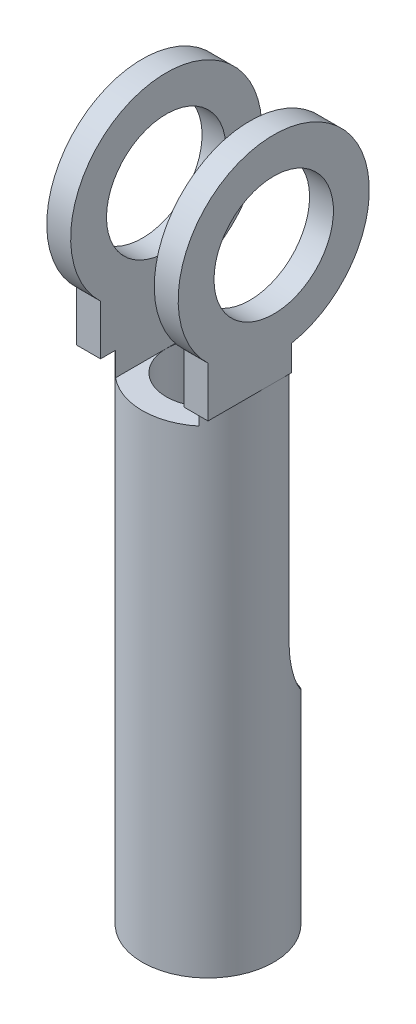
ISO-10303-21;
HEADER;
FILE_DESCRIPTION(('STEP AP214'),'2;1');
FILE_NAME('part.step','',(''),(''),'','','');
FILE_SCHEMA(('AUTOMOTIVE_DESIGN { 1 0 10303 214 1 1 1 1 }'));
ENDSEC;
DATA;
#1=APPLICATION_CONTEXT('core data for automotive mechanical design processes');
#2=APPLICATION_PROTOCOL_DEFINITION('international standard','automotive_design',2000,#1);
#3=PRODUCT_CONTEXT('',#1,'mechanical');
#4=PRODUCT('Part','Part','',(#3));
#5=PRODUCT_RELATED_PRODUCT_CATEGORY('part','',(#4));
#6=PRODUCT_DEFINITION_FORMATION('','',#4);
#7=PRODUCT_DEFINITION_CONTEXT('part definition',#1,'design');
#8=PRODUCT_DEFINITION('design','',#6,#7);
#9=PRODUCT_DEFINITION_SHAPE('','',#8);
#10=(LENGTH_UNIT() NAMED_UNIT(*) SI_UNIT(.MILLI.,.METRE.));
#11=(NAMED_UNIT(*) PLANE_ANGLE_UNIT() SI_UNIT($,.RADIAN.));
#12=(NAMED_UNIT(*) SI_UNIT($,.STERADIAN.) SOLID_ANGLE_UNIT());
#13=UNCERTAINTY_MEASURE_WITH_UNIT(LENGTH_MEASURE(1.E-05),#10,'distance_accuracy_value','');
#14=(GEOMETRIC_REPRESENTATION_CONTEXT(3) GLOBAL_UNCERTAINTY_ASSIGNED_CONTEXT((#13)) GLOBAL_UNIT_ASSIGNED_CONTEXT((#10,
#11,#12)) REPRESENTATION_CONTEXT('',''));
#15=CARTESIAN_POINT('',(0.,0.,0.));
#16=DIRECTION('',(0.,0.,1.));
#17=DIRECTION('',(1.,0.,0.));
#18=AXIS2_PLACEMENT_3D('',#15,#16,#17);
#19=CARTESIAN_POINT('',(2.75,30.,-4.));
#20=DIRECTION('',(-1.,0.,0.));
#21=DIRECTION('',(0.,0.,1.));
#22=AXIS2_PLACEMENT_3D('',#19,#20,#21);
#23=PLANE('',#22);
#24=CARTESIAN_POINT('',(2.75,26.,0.));
#25=DIRECTION('',(-1.,0.,0.));
#26=DIRECTION('',(0.,0.,1.));
#27=AXIS2_PLACEMENT_3D('',#24,#25,#26);
#28=CIRCLE('',#27,2.5);
#29=CARTESIAN_POINT('',(2.75,26.,2.5));
#30=VERTEX_POINT('',#29);
#31=EDGE_CURVE('E273',#30,#30,#28,.T.);
#32=ORIENTED_EDGE('',*,*,#31,.T.);
#33=EDGE_LOOP('',(#32));
#34=FACE_BOUND('',#33,.T.);
#35=DIRECTION('',(0.,0.,-1.));
#36=VECTOR('',#35,1.);
#37=CARTESIAN_POINT('',(2.75,21.,-4.2121708077484));
#38=LINE('',#37,#36);
#39=CARTESIAN_POINT('',(2.75,21.,0.));
#40=VERTEX_POINT('',#39);
#41=CARTESIAN_POINT('',(2.75,21.,-0.749999999999998));
#42=VERTEX_POINT('',#41);
#43=EDGE_CURVE('E229',#40,#42,#38,.T.);
#44=ORIENTED_EDGE('',*,*,#43,.T.);
#45=DIRECTION('',(0.,1.,0.));
#46=VECTOR('',#45,1.);
#47=CARTESIAN_POINT('',(2.75,14.8976549918115,-0.749999999999998));
#48=LINE('',#47,#46);
#49=CARTESIAN_POINT('',(2.75,22.0709415886246,-0.749999999999999));
#50=VERTEX_POINT('',#49);
#51=EDGE_CURVE('E298',#42,#50,#48,.T.);
#52=ORIENTED_EDGE('',*,*,#51,.T.);
#53=CARTESIAN_POINT('',(2.75,26.,0.));
#54=DIRECTION('',(-1.,0.,0.));
#55=DIRECTION('',(0.,0.,1.));
#56=AXIS2_PLACEMENT_3D('',#53,#54,#55);
#57=CIRCLE('',#56,4.);
#58=CARTESIAN_POINT('',(2.75,23.0952624903444,2.75));
#59=VERTEX_POINT('',#58);
#60=EDGE_CURVE('E295',#59,#50,#57,.T.);
#61=ORIENTED_EDGE('',*,*,#60,.F.);
#62=DIRECTION('',(0.,1.,0.));
#63=VECTOR('',#62,1.);
#64=CARTESIAN_POINT('',(2.75,14.8976549918115,2.75));
#65=LINE('',#64,#63);
#66=CARTESIAN_POINT('',(2.75,21.,2.75));
#67=VERTEX_POINT('',#66);
#68=EDGE_CURVE('E256',#67,#59,#65,.T.);
#69=ORIENTED_EDGE('',*,*,#68,.F.);
#70=DIRECTION('',(0.,0.,-1.));
#71=VECTOR('',#70,1.);
#72=CARTESIAN_POINT('',(2.75,21.,-4.2121708077484));
#73=LINE('',#72,#71);
#74=EDGE_CURVE('E130',#67,#40,#73,.T.);
#75=ORIENTED_EDGE('',*,*,#74,.T.);
#76=EDGE_LOOP('',(#44,#52,#61,#69,#75));
#77=FACE_BOUND('',#76,.T.);
#78=ADVANCED_FACE('F113',(#34,#77),#23,.F.);
#79=CARTESIAN_POINT('',(-2.75,20.,-0.749999999999999));
#80=DIRECTION('',(0.,0.,1.));
#81=DIRECTION('',(0.,-1.,0.));
#82=AXIS2_PLACEMENT_3D('',#79,#80,#81);
#83=PLANE('',#82);
#84=DIRECTION('',(-1.,0.,0.));
#85=VECTOR('',#84,1.);
#86=CARTESIAN_POINT('',(0.,21.,-0.750000000000002));
#87=LINE('',#86,#85);
#88=CARTESIAN_POINT('',(2.64575131106459,21.,-0.749999999999999));
#89=VERTEX_POINT('',#88);
#90=EDGE_CURVE('E234',#42,#89,#87,.T.);
#91=ORIENTED_EDGE('',*,*,#90,.T.);
#92=DIRECTION('',(0.,-1.,0.));
#93=VECTOR('',#92,1.);
#94=CARTESIAN_POINT('',(2.64575131106459,20.,-0.749999999999999));
#95=LINE('',#94,#93);
#96=CARTESIAN_POINT('',(2.64575131106459,11.1622776601684,-0.75));
#97=VERTEX_POINT('',#96);
#98=EDGE_CURVE('E246',#97,#89,#95,.F.);
#99=ORIENTED_EDGE('',*,*,#98,.F.);
#100=DIRECTION('',(1.,0.,0.));
#101=VECTOR('',#100,1.);
#102=CARTESIAN_POINT('',(-2.75,11.1622776601684,-0.75));
#103=LINE('',#102,#101);
#104=CARTESIAN_POINT('',(1.58113883008419,11.1622776601684,-0.749999999999999));
#105=VERTEX_POINT('',#104);
#106=EDGE_CURVE('E321',#105,#97,#103,.T.);
#107=ORIENTED_EDGE('',*,*,#106,.F.);
#108=DIRECTION('',(0.,-1.,0.));
#109=VECTOR('',#108,1.);
#110=CARTESIAN_POINT('',(1.58113883008419,20.,-0.749999999999999));
#111=LINE('',#110,#109);
#112=CARTESIAN_POINT('',(1.58113883008419,20.,-0.749999999999999));
#113=VERTEX_POINT('',#112);
#114=EDGE_CURVE('E364',#105,#113,#111,.F.);
#115=ORIENTED_EDGE('',*,*,#114,.T.);
#116=DIRECTION('',(1.,0.,0.));
#117=VECTOR('',#116,1.);
#118=CARTESIAN_POINT('',(-2.75,20.,-0.749999999999999));
#119=LINE('',#118,#117);
#120=CARTESIAN_POINT('',(1.75,20.,-0.749999999999999));
#121=VERTEX_POINT('',#120);
#122=EDGE_CURVE('E326',#113,#121,#119,.T.);
#123=ORIENTED_EDGE('',*,*,#122,.T.);
#124=DIRECTION('',(0.,-1.,0.));
#125=VECTOR('',#124,1.);
#126=CARTESIAN_POINT('',(1.75,30.,-0.749999999999999));
#127=LINE('',#126,#125);
#128=CARTESIAN_POINT('',(1.75,22.0709415886246,-0.749999999999999));
#129=VERTEX_POINT('',#128);
#130=EDGE_CURVE('E123',#129,#121,#127,.T.);
#131=ORIENTED_EDGE('',*,*,#130,.F.);
#132=DIRECTION('',(-1.,0.,0.));
#133=VECTOR('',#132,1.);
#134=CARTESIAN_POINT('',(2.75,22.0709415886246,-0.749999999999999));
#135=LINE('',#134,#133);
#136=EDGE_CURVE('E305',#50,#129,#135,.T.);
#137=ORIENTED_EDGE('',*,*,#136,.F.);
#138=ORIENTED_EDGE('',*,*,#51,.F.);
#139=EDGE_LOOP('',(#91,#99,#107,#115,#123,#131,#137,#138));
#140=FACE_BOUND('',#139,.T.);
#141=ADVANCED_FACE('F385',(#140),#83,.F.);
#142=CARTESIAN_POINT('',(-2.75,30.,-4.));
#143=DIRECTION('',(1.,0.,0.));
#144=DIRECTION('',(0.,0.,-1.));
#145=AXIS2_PLACEMENT_3D('',#142,#143,#144);
#146=PLANE('',#145);
#147=CARTESIAN_POINT('',(-2.75,26.,0.));
#148=DIRECTION('',(-1.,0.,0.));
#149=DIRECTION('',(0.,0.,1.));
#150=AXIS2_PLACEMENT_3D('',#147,#148,#149);
#151=CIRCLE('',#150,2.5);
#152=CARTESIAN_POINT('',(-2.75,26.,2.5));
#153=VERTEX_POINT('',#152);
#154=EDGE_CURVE('E274',#153,#153,#151,.T.);
#155=ORIENTED_EDGE('',*,*,#154,.F.);
#156=EDGE_LOOP('',(#155));
#157=FACE_BOUND('',#156,.T.);
#158=DIRECTION('',(0.,0.,-1.));
#159=VECTOR('',#158,1.);
#160=CARTESIAN_POINT('',(-2.75,21.,-4.2121708077484));
#161=LINE('',#160,#159);
#162=CARTESIAN_POINT('',(-2.75,21.,0.));
#163=VERTEX_POINT('',#162);
#164=CARTESIAN_POINT('',(-2.75,21.,-0.749999999999999));
#165=VERTEX_POINT('',#164);
#166=EDGE_CURVE('E408',#163,#165,#161,.T.);
#167=ORIENTED_EDGE('',*,*,#166,.F.);
#168=DIRECTION('',(0.,0.,-1.));
#169=VECTOR('',#168,1.);
#170=CARTESIAN_POINT('',(-2.75,21.,-4.2121708077484));
#171=LINE('',#170,#169);
#172=CARTESIAN_POINT('',(-2.75,21.,2.75));
#173=VERTEX_POINT('',#172);
#174=EDGE_CURVE('E267',#173,#163,#171,.T.);
#175=ORIENTED_EDGE('',*,*,#174,.F.);
#176=DIRECTION('',(0.,1.,0.));
#177=VECTOR('',#176,1.);
#178=CARTESIAN_POINT('',(-2.75,14.8976549918115,2.75));
#179=LINE('',#178,#177);
#180=CARTESIAN_POINT('',(-2.75,23.0952624903444,2.75));
#181=VERTEX_POINT('',#180);
#182=EDGE_CURVE('E285',#173,#181,#179,.T.);
#183=ORIENTED_EDGE('',*,*,#182,.T.);
#184=CARTESIAN_POINT('',(-2.75,26.,0.));
#185=DIRECTION('',(-1.,0.,0.));
#186=DIRECTION('',(0.,0.,1.));
#187=AXIS2_PLACEMENT_3D('',#184,#185,#186);
#188=CIRCLE('',#187,4.);
#189=CARTESIAN_POINT('',(-2.75,22.0709415886246,-0.749999999999999));
#190=VERTEX_POINT('',#189);
#191=EDGE_CURVE('E294',#181,#190,#188,.T.);
#192=ORIENTED_EDGE('',*,*,#191,.T.);
#193=DIRECTION('',(0.,1.,0.));
#194=VECTOR('',#193,1.);
#195=CARTESIAN_POINT('',(-2.75,14.8976549918115,-0.749999999999999));
#196=LINE('',#195,#194);
#197=EDGE_CURVE('E299',#165,#190,#196,.T.);
#198=ORIENTED_EDGE('',*,*,#197,.F.);
#199=EDGE_LOOP('',(#167,#175,#183,#192,#198));
#200=FACE_BOUND('',#199,.T.);
#201=ADVANCED_FACE('F391',(#157,#200),#146,.F.);
#202=DIRECTION('',(0.,-1.,0.));
#203=VECTOR('',#202,1.);
#204=CARTESIAN_POINT('',(-2.64575131106459,20.,-0.749999999999999));
#205=LINE('',#204,#203);
#206=CARTESIAN_POINT('',(-2.64575131106459,21.,-0.749999999999999));
#207=VERTEX_POINT('',#206);
#208=CARTESIAN_POINT('',(-2.64575131106459,11.1622776601684,-0.75));
#209=VERTEX_POINT('',#208);
#210=EDGE_CURVE('E330',#207,#209,#205,.T.);
#211=ORIENTED_EDGE('',*,*,#210,.F.);
#212=DIRECTION('',(1.,0.,0.));
#213=VECTOR('',#212,1.);
#214=CARTESIAN_POINT('',(0.,21.,-0.749999999999999));
#215=LINE('',#214,#213);
#216=EDGE_CURVE('E413',#165,#207,#215,.T.);
#217=ORIENTED_EDGE('',*,*,#216,.F.);
#218=ORIENTED_EDGE('',*,*,#197,.T.);
#219=CARTESIAN_POINT('',(-1.75,22.0709415886246,-0.749999999999999));
#220=VERTEX_POINT('',#219);
#221=EDGE_CURVE('E301',#220,#190,#135,.T.);
#222=ORIENTED_EDGE('',*,*,#221,.F.);
#223=DIRECTION('',(0.,1.,0.));
#224=VECTOR('',#223,1.);
#225=CARTESIAN_POINT('',(-1.75,30.,-0.75));
#226=LINE('',#225,#224);
#227=CARTESIAN_POINT('',(-1.75,20.,-0.749999999999999));
#228=VERTEX_POINT('',#227);
#229=EDGE_CURVE('E308',#228,#220,#226,.T.);
#230=ORIENTED_EDGE('',*,*,#229,.F.);
#231=CARTESIAN_POINT('',(-1.58113883008419,20.,-0.749999999999999));
#232=VERTEX_POINT('',#231);
#233=EDGE_CURVE('E325',#228,#232,#119,.T.);
#234=ORIENTED_EDGE('',*,*,#233,.T.);
#235=DIRECTION('',(0.,-1.,0.));
#236=VECTOR('',#235,1.);
#237=CARTESIAN_POINT('',(-1.58113883008419,20.,-0.749999999999999));
#238=LINE('',#237,#236);
#239=CARTESIAN_POINT('',(-1.58113883008419,11.1622776601684,-0.75));
#240=VERTEX_POINT('',#239);
#241=EDGE_CURVE('E363',#232,#240,#238,.T.);
#242=ORIENTED_EDGE('',*,*,#241,.T.);
#243=EDGE_CURVE('E324',#209,#240,#103,.T.);
#244=ORIENTED_EDGE('',*,*,#243,.F.);
#245=EDGE_LOOP('',(#211,#217,#218,#222,#230,#234,#242,#244));
#246=FACE_BOUND('',#245,.T.);
#247=ADVANCED_FACE('F352',(#246),#83,.F.);
#248=CARTESIAN_POINT('',(2.75,14.8976549918115,2.75));
#249=DIRECTION('',(0.,0.,1.));
#250=DIRECTION('',(1.,0.,0.));
#251=AXIS2_PLACEMENT_3D('',#248,#249,#250);
#252=PLANE('',#251);
#253=DIRECTION('',(0.,-1.,0.));
#254=VECTOR('',#253,1.);
#255=CARTESIAN_POINT('',(1.75,30.,2.75));
#256=LINE('',#255,#254);
#257=CARTESIAN_POINT('',(1.75,23.0952624903444,2.75));
#258=VERTEX_POINT('',#257);
#259=CARTESIAN_POINT('',(1.75,21.,2.75));
#260=VERTEX_POINT('',#259);
#261=EDGE_CURVE('E284',#258,#260,#256,.T.);
#262=ORIENTED_EDGE('',*,*,#261,.T.);
#263=DIRECTION('',(-1.,0.,0.));
#264=VECTOR('',#263,1.);
#265=CARTESIAN_POINT('',(0.,21.,2.75));
#266=LINE('',#265,#264);
#267=EDGE_CURVE('E251',#67,#260,#266,.T.);
#268=ORIENTED_EDGE('',*,*,#267,.F.);
#269=ORIENTED_EDGE('',*,*,#68,.T.);
#270=DIRECTION('',(-1.,0.,0.));
#271=VECTOR('',#270,1.);
#272=CARTESIAN_POINT('',(2.75,23.0952624903444,2.75));
#273=LINE('',#272,#271);
#274=EDGE_CURVE('E287',#59,#258,#273,.T.);
#275=ORIENTED_EDGE('',*,*,#274,.T.);
#276=EDGE_LOOP('',(#262,#268,#269,#275));
#277=FACE_BOUND('',#276,.T.);
#278=ADVANCED_FACE('F401',(#277),#252,.T.);
#279=CARTESIAN_POINT('',(-1.75,30.,-4.));
#280=DIRECTION('',(-1.,0.,0.));
#281=DIRECTION('',(0.,0.,1.));
#282=AXIS2_PLACEMENT_3D('',#279,#280,#281);
#283=PLANE('',#282);
#284=CARTESIAN_POINT('',(-1.75,26.,0.));
#285=DIRECTION('',(-1.,0.,0.));
#286=DIRECTION('',(0.,0.,1.));
#287=AXIS2_PLACEMENT_3D('',#284,#285,#286);
#288=CIRCLE('',#287,2.5);
#289=CARTESIAN_POINT('',(-1.75,26.,2.5));
#290=VERTEX_POINT('',#289);
#291=EDGE_CURVE('E279',#290,#290,#288,.T.);
#292=ORIENTED_EDGE('',*,*,#291,.T.);
#293=EDGE_LOOP('',(#292));
#294=FACE_BOUND('',#293,.T.);
#295=DIRECTION('',(0.,-1.,0.));
#296=VECTOR('',#295,1.);
#297=CARTESIAN_POINT('',(-1.75,21.,2.12132034355964));
#298=LINE('',#297,#296);
#299=CARTESIAN_POINT('',(-1.75,20.,2.12132034355964));
#300=VERTEX_POINT('',#299);
#301=CARTESIAN_POINT('',(-1.75,21.,2.12132034355964));
#302=VERTEX_POINT('',#301);
#303=EDGE_CURVE('E271',#300,#302,#298,.F.);
#304=ORIENTED_EDGE('',*,*,#303,.F.);
#305=DIRECTION('',(0.,0.,-1.));
#306=VECTOR('',#305,1.);
#307=CARTESIAN_POINT('',(-1.75,20.,-4.));
#308=LINE('',#307,#306);
#309=CARTESIAN_POINT('',(-1.75,20.,0.));
#310=VERTEX_POINT('',#309);
#311=EDGE_CURVE('E317',#300,#310,#308,.T.);
#312=ORIENTED_EDGE('',*,*,#311,.T.);
#313=EDGE_CURVE('E320',#310,#228,#308,.T.);
#314=ORIENTED_EDGE('',*,*,#313,.T.);
#315=ORIENTED_EDGE('',*,*,#229,.T.);
#316=CARTESIAN_POINT('',(-1.75,26.,0.));
#317=DIRECTION('',(-1.,0.,0.));
#318=DIRECTION('',(0.,0.,1.));
#319=AXIS2_PLACEMENT_3D('',#316,#317,#318);
#320=CIRCLE('',#319,4.);
#321=CARTESIAN_POINT('',(-1.75,23.0952624903444,2.75));
#322=VERTEX_POINT('',#321);
#323=EDGE_CURVE('E311',#322,#220,#320,.T.);
#324=ORIENTED_EDGE('',*,*,#323,.F.);
#325=DIRECTION('',(0.,1.,0.));
#326=VECTOR('',#325,1.);
#327=CARTESIAN_POINT('',(-1.75,30.,2.75));
#328=LINE('',#327,#326);
#329=CARTESIAN_POINT('',(-1.75,21.,2.75));
#330=VERTEX_POINT('',#329);
#331=EDGE_CURVE('E292',#330,#322,#328,.T.);
#332=ORIENTED_EDGE('',*,*,#331,.F.);
#333=DIRECTION('',(0.,0.,1.));
#334=VECTOR('',#333,1.);
#335=CARTESIAN_POINT('',(-1.75,21.,-4.));
#336=LINE('',#335,#334);
#337=EDGE_CURVE('E138',#302,#330,#336,.T.);
#338=ORIENTED_EDGE('',*,*,#337,.F.);
#339=EDGE_LOOP('',(#304,#312,#314,#315,#324,#332,#338));
#340=FACE_BOUND('',#339,.T.);
#341=ADVANCED_FACE('F350',(#294,#340),#283,.F.);
#342=ORIENTED_EDGE('',*,*,#182,.F.);
#343=DIRECTION('',(1.,0.,0.));
#344=VECTOR('',#343,1.);
#345=CARTESIAN_POINT('',(0.,21.,2.75));
#346=LINE('',#345,#344);
#347=EDGE_CURVE('E265',#173,#330,#346,.T.);
#348=ORIENTED_EDGE('',*,*,#347,.T.);
#349=ORIENTED_EDGE('',*,*,#331,.T.);
#350=EDGE_CURVE('E282',#322,#181,#273,.T.);
#351=ORIENTED_EDGE('',*,*,#350,.T.);
#352=EDGE_LOOP('',(#342,#348,#349,#351));
#353=FACE_BOUND('',#352,.T.);
#354=ADVANCED_FACE('F420',(#353),#252,.T.);
#355=CARTESIAN_POINT('',(1.75,30.,-4.));
#356=DIRECTION('',(1.,0.,0.));
#357=DIRECTION('',(0.,0.,-1.));
#358=AXIS2_PLACEMENT_3D('',#355,#356,#357);
#359=PLANE('',#358);
#360=CARTESIAN_POINT('',(1.75,26.,0.));
#361=DIRECTION('',(1.,0.,0.));
#362=DIRECTION('',(0.,0.,-1.));
#363=AXIS2_PLACEMENT_3D('',#360,#361,#362);
#364=CIRCLE('',#363,2.5);
#365=CARTESIAN_POINT('',(1.75,26.,-2.5));
#366=VERTEX_POINT('',#365);
#367=EDGE_CURVE('E118',#366,#366,#364,.T.);
#368=ORIENTED_EDGE('',*,*,#367,.T.);
#369=EDGE_LOOP('',(#368));
#370=FACE_BOUND('',#369,.T.);
#371=DIRECTION('',(0.,0.,1.));
#372=VECTOR('',#371,1.);
#373=CARTESIAN_POINT('',(1.75,20.,-4.));
#374=LINE('',#373,#372);
#375=CARTESIAN_POINT('',(1.75,20.,0.));
#376=VERTEX_POINT('',#375);
#377=CARTESIAN_POINT('',(1.75,20.,2.12132034355964));
#378=VERTEX_POINT('',#377);
#379=EDGE_CURVE('E313',#376,#378,#374,.T.);
#380=ORIENTED_EDGE('',*,*,#379,.T.);
#381=DIRECTION('',(0.,-1.,0.));
#382=VECTOR('',#381,1.);
#383=CARTESIAN_POINT('',(1.75,21.,2.12132034355964));
#384=LINE('',#383,#382);
#385=CARTESIAN_POINT('',(1.75,21.,2.12132034355964));
#386=VERTEX_POINT('',#385);
#387=EDGE_CURVE('E258',#378,#386,#384,.F.);
#388=ORIENTED_EDGE('',*,*,#387,.T.);
#389=DIRECTION('',(0.,0.,-1.));
#390=VECTOR('',#389,1.);
#391=CARTESIAN_POINT('',(1.75,21.,-4.));
#392=LINE('',#391,#390);
#393=EDGE_CURVE('E250',#260,#386,#392,.T.);
#394=ORIENTED_EDGE('',*,*,#393,.F.);
#395=ORIENTED_EDGE('',*,*,#261,.F.);
#396=CARTESIAN_POINT('',(1.75,26.,0.));
#397=DIRECTION('',(1.,0.,0.));
#398=DIRECTION('',(0.,0.,-1.));
#399=AXIS2_PLACEMENT_3D('',#396,#397,#398);
#400=CIRCLE('',#399,4.);
#401=EDGE_CURVE('E12',#129,#258,#400,.T.);
#402=ORIENTED_EDGE('',*,*,#401,.F.);
#403=ORIENTED_EDGE('',*,*,#130,.T.);
#404=EDGE_CURVE('E316',#121,#376,#374,.T.);
#405=ORIENTED_EDGE('',*,*,#404,.T.);
#406=EDGE_LOOP('',(#380,#388,#394,#395,#402,#403,#405));
#407=FACE_BOUND('',#406,.T.);
#408=ADVANCED_FACE('F394',(#370,#407),#359,.F.);
#409=CARTESIAN_POINT('',(0.,20.,0.));
#410=DIRECTION('',(0.,1.,0.));
#411=DIRECTION('',(0.,0.,1.));
#412=AXIS2_PLACEMENT_3D('',#409,#410,#411);
#413=PLANE('',#412);
#414=CARTESIAN_POINT('',(0.,20.,0.));
#415=DIRECTION('',(0.,1.,0.));
#416=DIRECTION('',(0.,0.,1.));
#417=AXIS2_PLACEMENT_3D('',#414,#415,#416);
#418=CIRCLE('',#417,2.75);
#419=EDGE_CURVE('E444',#300,#378,#418,.T.);
#420=ORIENTED_EDGE('',*,*,#419,.T.);
#421=ORIENTED_EDGE('',*,*,#379,.F.);
#422=CARTESIAN_POINT('',(0.,20.,0.));
#423=DIRECTION('',(0.,1.,0.));
#424=DIRECTION('',(0.,0.,1.));
#425=AXIS2_PLACEMENT_3D('',#422,#423,#424);
#426=CIRCLE('',#425,1.75);
#427=EDGE_CURVE('E454',#310,#376,#426,.T.);
#428=ORIENTED_EDGE('',*,*,#427,.F.);
#429=ORIENTED_EDGE('',*,*,#311,.F.);
#430=EDGE_LOOP('',(#420,#421,#428,#429));
#431=FACE_BOUND('',#430,.T.);
#432=ADVANCED_FACE('F376',(#431),#413,.T.);
#433=EDGE_CURVE('E452',#376,#113,#426,.T.);
#434=ORIENTED_EDGE('',*,*,#433,.F.);
#435=ORIENTED_EDGE('',*,*,#404,.F.);
#436=ORIENTED_EDGE('',*,*,#122,.F.);
#437=EDGE_LOOP('',(#434,#435,#436));
#438=FACE_BOUND('',#437,.T.);
#439=ADVANCED_FACE('F374',(#438),#413,.T.);
#440=ORIENTED_EDGE('',*,*,#313,.F.);
#441=EDGE_CURVE('E340',#232,#310,#426,.T.);
#442=ORIENTED_EDGE('',*,*,#441,.F.);
#443=ORIENTED_EDGE('',*,*,#233,.F.);
#444=EDGE_LOOP('',(#440,#442,#443));
#445=FACE_BOUND('',#444,.T.);
#446=ADVANCED_FACE('F371',(#445),#413,.T.);
#447=CARTESIAN_POINT('',(0.,0.,0.));
#448=DIRECTION('',(0.,1.,0.));
#449=DIRECTION('',(0.,0.,1.));
#450=AXIS2_PLACEMENT_3D('',#447,#448,#449);
#451=PLANE('',#450);
#452=CARTESIAN_POINT('',(0.,0.,0.));
#453=DIRECTION('',(0.,1.,0.));
#454=DIRECTION('',(0.,0.,1.));
#455=AXIS2_PLACEMENT_3D('',#452,#453,#454);
#456=CIRCLE('',#455,2.75);
#457=CARTESIAN_POINT('',(0.,0.,2.75));
#458=VERTEX_POINT('',#457);
#459=EDGE_CURVE('E447',#458,#458,#456,.T.);
#460=ORIENTED_EDGE('',*,*,#459,.F.);
#461=EDGE_LOOP('',(#460));
#462=FACE_BOUND('',#461,.T.);
#463=CARTESIAN_POINT('',(0.,0.,0.));
#464=DIRECTION('',(0.,1.,0.));
#465=DIRECTION('',(0.,0.,1.));
#466=AXIS2_PLACEMENT_3D('',#463,#464,#465);
#467=CIRCLE('',#466,1.75);
#468=CARTESIAN_POINT('',(0.,0.,1.75));
#469=VERTEX_POINT('',#468);
#470=EDGE_CURVE('E339',#469,#469,#467,.T.);
#471=ORIENTED_EDGE('',*,*,#470,.T.);
#472=EDGE_LOOP('',(#471));
#473=FACE_BOUND('',#472,.T.);
#474=ADVANCED_FACE('F373',(#462,#473),#451,.F.);
#475=CARTESIAN_POINT('',(0.,20.,0.));
#476=DIRECTION('',(0.,-1.,0.));
#477=DIRECTION('',(0.,0.,-1.));
#478=AXIS2_PLACEMENT_3D('',#475,#476,#477);
#479=CYLINDRICAL_SURFACE('',#478,2.75);
#480=CARTESIAN_POINT('',(0.,21.,0.));
#481=DIRECTION('',(0.,-1.,0.));
#482=DIRECTION('',(0.,0.,-1.));
#483=AXIS2_PLACEMENT_3D('',#480,#481,#482);
#484=CIRCLE('',#483,2.75);
#485=EDGE_CURVE('E263',#302,#163,#484,.T.);
#486=ORIENTED_EDGE('',*,*,#485,.T.);
#487=CARTESIAN_POINT('',(0.,21.,0.));
#488=DIRECTION('',(0.,-1.,0.));
#489=DIRECTION('',(0.,0.,-1.));
#490=AXIS2_PLACEMENT_3D('',#487,#488,#489);
#491=CIRCLE('',#490,2.75);
#492=EDGE_CURVE('E252',#163,#207,#491,.T.);
#493=ORIENTED_EDGE('',*,*,#492,.T.);
#494=ORIENTED_EDGE('',*,*,#210,.T.);
#495=CARTESIAN_POINT('',(-2.64575131106459,11.1622776601684,-0.75));
#496=CARTESIAN_POINT('',(-2.6457200406596,11.0703917954332,-0.749988804882271));
#497=CARTESIAN_POINT('',(-2.64472449352821,10.978503232409,-0.753618021003756));
#498=CARTESIAN_POINT('',(-2.64057914864245,10.7953215733858,-0.768080187676828));
#499=CARTESIAN_POINT('',(-2.63742882395763,10.7040286285535,-0.778914900246476));
#500=CARTESIAN_POINT('',(-2.62872178469472,10.5221365407157,-0.807797933602273));
#501=CARTESIAN_POINT('',(-2.62315063907084,10.4315449274207,-0.825889463346521));
#502=CARTESIAN_POINT('',(-2.60915036156118,10.2522849517291,-0.869110902034123));
#503=CARTESIAN_POINT('',(-2.6007214480497,10.1636164429304,-0.894240273160302));
#504=CARTESIAN_POINT('',(-2.58037314618997,9.98860583870593,-0.951364995157775));
#505=CARTESIAN_POINT('',(-2.56844270973875,9.902272066217,-0.983381991344892));
#506=CARTESIAN_POINT('',(-2.54035075384295,9.73297841155038,-1.05382917843493));
#507=CARTESIAN_POINT('',(-2.52418977863484,9.65001809698,-1.09225854418996));
#508=CARTESIAN_POINT('',(-2.48683139546325,9.48851306324427,-1.1748247876786));
#509=CARTESIAN_POINT('',(-2.46565098389168,9.40995452565001,-1.21894218008748));
#510=CARTESIAN_POINT('',(-2.41734056127117,9.25781817426556,-1.3121432738619));
#511=CARTESIAN_POINT('',(-2.39021283835894,9.18423845915842,-1.36122506135157));
#512=CARTESIAN_POINT('',(-2.31438176321143,9.00879235671444,-1.48791517478262));
#513=CARTESIAN_POINT('',(-2.26157537147689,8.91032982477515,-1.56789519173485));
#514=CARTESIAN_POINT('',(-2.13873371496362,8.72853307573961,-1.73169265852289));
#515=CARTESIAN_POINT('',(-2.06870755370295,8.64519090533892,-1.81550806172318));
#516=CARTESIAN_POINT('',(-1.91047407335175,8.49472996803534,-1.98134768136933));
#517=CARTESIAN_POINT('',(-1.82220777003465,8.42766540837529,-2.0633651073411));
#518=CARTESIAN_POINT('',(-1.62891215521754,8.31006081951527,-2.21913080696782));
#519=CARTESIAN_POINT('',(-1.52387902086474,8.259524566815,-2.29287718827271));
#520=CARTESIAN_POINT('',(-1.30639975014991,8.17601606314767,-2.42300819899103));
#521=CARTESIAN_POINT('',(-1.19472079642313,8.14220479668142,-2.48014440784287));
#522=CARTESIAN_POINT('',(-0.962128166632215,8.08623748951935,-2.57930245465529));
#523=CARTESIAN_POINT('',(-0.84121335010811,8.06408289088166,-2.62132242236716));
#524=CARTESIAN_POINT('',(-0.589321683082576,8.02922859107371,-2.6893825717615));
#525=CARTESIAN_POINT('',(-0.458144781287942,8.01686336699455,-2.71485251368916));
#526=CARTESIAN_POINT('',(-0.192929704287217,8.00162569595917,-2.74647534867578));
#527=CARTESIAN_POINT('',(-0.0588908256748486,7.99875561035337,-2.75262343655484));
#528=CARTESIAN_POINT('',(0.213667171579016,8.00227692168716,-2.74520065680056));
#529=CARTESIAN_POINT('',(0.352161804202512,8.00902635513009,-2.73086742634732));
#530=CARTESIAN_POINT('',(0.624532025765891,8.03318350358518,-2.68171690676052));
#531=CARTESIAN_POINT('',(0.758407401657692,8.05059170950603,-2.64689867415672));
#532=CARTESIAN_POINT('',(1.01716963546273,8.09769202490589,-2.55861056231558));
#533=CARTESIAN_POINT('',(1.14208114596476,8.12734879906876,-2.50519440438339));
#534=CARTESIAN_POINT('',(1.3793479709994,8.20109560595515,-2.38279037831006));
#535=CARTESIAN_POINT('',(1.49171063936149,8.24517712537672,-2.31381170240855));
#536=CARTESIAN_POINT('',(1.69605417844957,8.34740042656837,-2.16817273573919));
#537=CARTESIAN_POINT('',(1.78870209983668,8.40485878328454,-2.09196825831918));
#538=CARTESIAN_POINT('',(1.95755124358061,8.53536730785318,-1.93488980766862));
#539=CARTESIAN_POINT('',(2.03375505000005,8.60841502236781,-1.85401657063212));
#540=CARTESIAN_POINT('',(2.16807919420336,8.76775908699283,-1.69486950074008));
#541=CARTESIAN_POINT('',(2.22653855861843,8.85375277230771,-1.6165763834115));
#542=CARTESIAN_POINT('',(2.3287439166161,9.03836900238349,-1.46553354078044));
#543=CARTESIAN_POINT('',(2.37248485817809,9.13699586741126,-1.39278572548706));
#544=CARTESIAN_POINT('',(2.45085152931128,9.35405674841167,-1.25021999499654));
#545=CARTESIAN_POINT('',(2.48429724777554,9.47347516588937,-1.18126006856056));
#546=CARTESIAN_POINT('',(2.5396086898667,9.72183383178482,-1.05712531997357));
#547=CARTESIAN_POINT('',(2.56146268736932,9.85078357241446,-1.00196448659487));
#548=CARTESIAN_POINT('',(2.59947596455075,10.1377062561096,-0.899296410739735));
#549=CARTESIAN_POINT('',(2.61405534150239,10.2969085917549,-0.854644654389781));
#550=CARTESIAN_POINT('',(2.63483369296223,10.6203936934203,-0.788268577128466));
#551=CARTESIAN_POINT('',(2.6410427422351,10.7846701079606,-0.766516700194109));
#552=CARTESIAN_POINT('',(2.64452393729796,10.9849600453645,-0.754313197741749));
#553=CARTESIAN_POINT('',(2.644985370861,11.0204270950735,-0.752694960612713));
#554=CARTESIAN_POINT('',(2.64559926683536,11.0913523424739,-0.750539612767514));
#555=CARTESIAN_POINT('',(2.64575211474376,11.126810495812,-0.750001153157418));
#556=CARTESIAN_POINT('',(2.64575131106459,11.1622776601684,-0.75));
#557=B_SPLINE_CURVE_WITH_KNOTS('',3,(#495,#496,#497,#498,#499,#500,#501,#502,#503,#504,#505,
#506,#507,#508,#509,#510,#511,#512,#513,#514,#515,#516,#517,#518,#519,#520,#521,#522,#523,#524,
#525,#526,#527,#528,#529,#530,#531,#532,#533,#534,#535,#536,#537,#538,#539,#540,#541,#542,#543,
#544,#545,#546,#547,#548,#549,#550,#551,#552,#553,#554,#555,#556),.UNSPECIFIED.,.F.,.F.,(4,2,2,
2,2,2,2,2,2,2,2,2,2,2,2,2,2,2,2,2,2,2,2,2,2,2,2,2,2,2,4),(0.,0.275585096093836,
0.551237608022252,0.828556385628285,1.10585397689082,1.38403608789786,1.66218242981638,
1.9394000645913,2.21651123072616,2.62682327686293,3.0369188692991,3.44836196804997,
3.85989901054189,4.24790657170095,4.63596212238695,5.03676445081765,5.43766644747628,
5.85388542598451,6.27012357563873,6.68516923519468,7.09997038053009,7.49699720975782,
7.89396160385282,8.28277919975693,8.67173011942481,9.09580879071238,9.52031564352194,
10.0163473050915,10.5117813941728,10.6182935727888,10.7246726097562),.UNSPECIFIED.);
#558=EDGE_CURVE('E333',#209,#97,#557,.T.);
#559=ORIENTED_EDGE('',*,*,#558,.T.);
#560=ORIENTED_EDGE('',*,*,#98,.T.);
#561=CARTESIAN_POINT('',(0.,21.,0.));
#562=DIRECTION('',(0.,-1.,0.));
#563=DIRECTION('',(0.,0.,-1.));
#564=AXIS2_PLACEMENT_3D('',#561,#562,#563);
#565=CIRCLE('',#564,2.75);
#566=EDGE_CURVE('E232',#89,#40,#565,.T.);
#567=ORIENTED_EDGE('',*,*,#566,.T.);
#568=CARTESIAN_POINT('',(0.,21.,0.));
#569=DIRECTION('',(0.,-1.,0.));
#570=DIRECTION('',(0.,0.,-1.));
#571=AXIS2_PLACEMENT_3D('',#568,#569,#570);
#572=CIRCLE('',#571,2.75);
#573=EDGE_CURVE('E243',#386,#40,#572,.F.);
#574=ORIENTED_EDGE('',*,*,#573,.F.);
#575=ORIENTED_EDGE('',*,*,#387,.F.);
#576=ORIENTED_EDGE('',*,*,#419,.F.);
#577=ORIENTED_EDGE('',*,*,#303,.T.);
#578=EDGE_LOOP('',(#486,#493,#494,#559,#560,#567,#574,#575,#576,#577));
#579=FACE_BOUND('',#578,.T.);
#580=ORIENTED_EDGE('',*,*,#459,.T.);
#581=EDGE_LOOP('',(#580));
#582=FACE_BOUND('',#581,.T.);
#583=ADVANCED_FACE('F115',(#579,#582),#479,.T.);
#584=CARTESIAN_POINT('',(0.,20.,0.));
#585=DIRECTION('',(0.,-1.,0.));
#586=DIRECTION('',(0.,0.,-1.));
#587=AXIS2_PLACEMENT_3D('',#584,#585,#586);
#588=CYLINDRICAL_SURFACE('',#587,1.75);
#589=ORIENTED_EDGE('',*,*,#241,.F.);
#590=ORIENTED_EDGE('',*,*,#441,.T.);
#591=ORIENTED_EDGE('',*,*,#427,.T.);
#592=ORIENTED_EDGE('',*,*,#433,.T.);
#593=ORIENTED_EDGE('',*,*,#114,.F.);
#594=CARTESIAN_POINT('',(-1.58113883008419,11.1622776601684,-0.75));
#595=CARTESIAN_POINT('',(-1.58111468872026,11.0886497508134,-0.749993157599744));
#596=CARTESIAN_POINT('',(-1.58003582819889,11.0150178982772,-0.752323069836396));
#597=CARTESIAN_POINT('',(-1.57559470334998,10.8680841718245,-0.761610868506501));
#598=CARTESIAN_POINT('',(-1.57223144114362,10.7947824562112,-0.76857077740086));
#599=CARTESIAN_POINT('',(-1.56301459348183,10.6483929576134,-0.787138778180593));
#600=CARTESIAN_POINT('',(-1.55714345998203,10.5753104073507,-0.798779588909791));
#601=CARTESIAN_POINT('',(-1.54255684332152,10.4303093911962,-0.826599760431169));
#602=CARTESIAN_POINT('',(-1.53384186479029,10.358390721153,-0.842778315946311));
#603=CARTESIAN_POINT('',(-1.51398505236689,10.2223411941965,-0.877906043190299));
#604=CARTESIAN_POINT('',(-1.50311975085858,10.1580764708296,-0.896492519904438));
#605=CARTESIAN_POINT('',(-1.47814388175829,10.0312899219354,-0.937101533562429));
#606=CARTESIAN_POINT('',(-1.46403383181499,9.96876782018208,-0.959123522244243));
#607=CARTESIAN_POINT('',(-1.43204993976319,9.84607121487904,-1.0062514528792));
#608=CARTESIAN_POINT('',(-1.41418614662788,9.78589094195051,-1.0313490878546));
#609=CARTESIAN_POINT('',(-1.37406014157653,9.66826492274711,-1.08423183428915));
#610=CARTESIAN_POINT('',(-1.35179950795117,9.61081820439044,-1.11201597957655));
#611=CARTESIAN_POINT('',(-1.29096723916193,9.47394953388888,-1.18277945604015));
#612=CARTESIAN_POINT('',(-1.2495730889992,9.39634800110485,-1.2269450884118));
#613=CARTESIAN_POINT('',(-1.15420323755963,9.2504519216396,-1.31703986207219));
#614=CARTESIAN_POINT('',(-1.10024437630043,9.18214511003581,-1.36296657482911));
#615=CARTESIAN_POINT('',(-0.989679709532126,9.06854978631016,-1.44459587503873));
#616=CARTESIAN_POINT('',(-0.935322390386022,9.02133288838223,-1.48064394972733));
#617=CARTESIAN_POINT('',(-0.817610855714227,8.93601913362228,-1.54874956140088));
#618=CARTESIAN_POINT('',(-0.754258794494038,8.8979200988474,-1.58080805048019));
#619=CARTESIAN_POINT('',(-0.61925100586056,8.83169057796666,-1.63842647821247));
#620=CARTESIAN_POINT('',(-0.547547634382369,8.8036214167403,-1.66394617769045));
#621=CARTESIAN_POINT('',(-0.398229363970479,8.75847889895933,-1.70584697293835));
#622=CARTESIAN_POINT('',(-0.320616748749721,8.74140131842849,-1.7222315789272));
#623=CARTESIAN_POINT('',(-0.170841863389905,8.71980711054099,-1.74310252267395));
#624=CARTESIAN_POINT('',(-0.0989954702926911,8.71413368886762,-1.74868220207415));
#625=CARTESIAN_POINT('',(0.0449671122078151,8.71186781430618,-1.750900764607));
#626=CARTESIAN_POINT('',(0.11708320174578,8.71527227941226,-1.74754268217281));
#627=CARTESIAN_POINT('',(0.256399731051517,8.73078202281522,-1.73247439673714));
#628=CARTESIAN_POINT('',(0.323680023190445,8.74252081605043,-1.7211161463028));
#629=CARTESIAN_POINT('',(0.454626448137855,8.7741268194673,-1.69124946083982));
#630=CARTESIAN_POINT('',(0.518292865934501,8.79399338768013,-1.67274159052729));
#631=CARTESIAN_POINT('',(0.641934799176802,8.84208124589706,-1.62935988284621));
#632=CARTESIAN_POINT('',(0.701789655414876,8.87048652413243,-1.60434768574953));
#633=CARTESIAN_POINT('',(0.815023237869197,8.93489491912306,-1.54990003018696));
#634=CARTESIAN_POINT('',(0.868400181255659,8.97090012006922,-1.52046335899912));
#635=CARTESIAN_POINT('',(0.972715166649425,9.0533761874201,-1.45616626653903));
#636=CARTESIAN_POINT('',(1.02297460487454,9.10050591005748,-1.42105601193674));
#637=CARTESIAN_POINT('',(1.11511377373984,9.20175622769544,-1.34996872585834));
#638=CARTESIAN_POINT('',(1.1569893187418,9.25588029252742,-1.31399127142702));
#639=CARTESIAN_POINT('',(1.22388580645772,9.35633273331092,-1.25146874390334));
#640=CARTESIAN_POINT('',(1.25054753316003,9.4014588148877,-1.22471319045516));
#641=CARTESIAN_POINT('',(1.29972130492805,9.49458158490751,-1.17239524515664));
#642=CARTESIAN_POINT('',(1.32223160151818,9.54257947166043,-1.14683335941788));
#643=CARTESIAN_POINT('',(1.38426127025159,9.69042099217962,-1.07261896028636));
#644=CARTESIAN_POINT('',(1.41818355962857,9.7939612490491,-1.02653367605882));
#645=CARTESIAN_POINT('',(1.46527830560976,9.97286366122294,-0.957382876833971));
#646=CARTESIAN_POINT('',(1.48161202706909,10.0464658611623,-0.931700403670693));
#647=CARTESIAN_POINT('',(1.50991062027755,10.1960356287815,-0.885107856206823));
#648=CARTESIAN_POINT('',(1.52187358862946,10.2720042113939,-0.864199862602901));
#649=CARTESIAN_POINT('',(1.54213717253553,10.4255884466465,-0.827496935442986));
#650=CARTESIAN_POINT('',(1.55043956134837,10.5032032826675,-0.811699527205914));
#651=CARTESIAN_POINT('',(1.56393311393534,10.6595540211692,-0.785386206204947));
#652=CARTESIAN_POINT('',(1.56912571832098,10.7382893872298,-0.77486784828073));
#653=CARTESIAN_POINT('',(1.5757131620363,10.8746875703567,-0.761359362807525));
#654=CARTESIAN_POINT('',(1.57775941652216,10.9321975568944,-0.757094940149583));
#655=CARTESIAN_POINT('',(1.58046600150417,11.0472300246395,-0.751418318519148));
#656=CARTESIAN_POINT('',(1.58113017970671,11.1047520240732,-0.749998201402576));
#657=CARTESIAN_POINT('',(1.58113883008419,11.1622776601684,-0.75));
#658=B_SPLINE_CURVE_WITH_KNOTS('',3,(#594,#595,#596,#597,#598,#599,#600,#601,#602,#603,#604,
#605,#606,#607,#608,#609,#610,#611,#612,#613,#614,#615,#616,#617,#618,#619,#620,#621,#622,#623,
#624,#625,#626,#627,#628,#629,#630,#631,#632,#633,#634,#635,#636,#637,#638,#639,#640,#641,#642,
#643,#644,#645,#646,#647,#648,#649,#650,#651,#652,#653,#654,#655,#656,#657),.UNSPECIFIED.,.F.,
.F.,(4,2,2,2,2,2,2,2,2,2,2,2,2,2,2,2,2,2,2,2,2,2,2,2,2,2,2,2,2,2,2,4),(0.,0.22084547561458,
0.44178748367118,0.664301462782916,0.886775979087273,1.08992725197004,1.29304613771282,
1.4956280370732,1.6981373493228,1.99229317621027,2.28605700330301,2.52662781824046,
2.76714111162863,3.00910076095174,3.25096737151832,3.46672862626603,3.68241663789107,
3.88916469033242,4.09589641601885,4.30744801243825,4.51905769998725,4.75017759775376,
4.98141259540385,5.15771850456346,5.33409850049802,5.68746045353968,5.92614799149857,
6.16493935074069,6.40361490719053,6.64217981119271,6.81521005505376,6.98775793393356),.UNSPECIFIED.);
#659=EDGE_CURVE('E356',#240,#105,#658,.T.);
#660=ORIENTED_EDGE('',*,*,#659,.F.);
#661=EDGE_LOOP('',(#589,#590,#591,#592,#593,#660));
#662=FACE_BOUND('',#661,.T.);
#663=ORIENTED_EDGE('',*,*,#470,.F.);
#664=EDGE_LOOP('',(#663));
#665=FACE_BOUND('',#664,.T.);
#666=ADVANCED_FACE('F348',(#662,#665),#588,.F.);
#667=CARTESIAN_POINT('',(-2.75,11.1622776601684,-4.25));
#668=DIRECTION('',(1.,0.,0.));
#669=DIRECTION('',(0.,0.,-1.));
#670=AXIS2_PLACEMENT_3D('',#667,#668,#669);
#671=CYLINDRICAL_SURFACE('',#670,3.5);
#672=ORIENTED_EDGE('',*,*,#243,.T.);
#673=ORIENTED_EDGE('',*,*,#659,.T.);
#674=ORIENTED_EDGE('',*,*,#106,.T.);
#675=ORIENTED_EDGE('',*,*,#558,.F.);
#676=EDGE_LOOP('',(#672,#673,#674,#675));
#677=FACE_BOUND('',#676,.T.);
#678=ADVANCED_FACE('F342',(#677),#671,.F.);
#679=CARTESIAN_POINT('',(2.75,26.,0.));
#680=DIRECTION('',(-1.,0.,0.));
#681=DIRECTION('',(0.,0.,1.));
#682=AXIS2_PLACEMENT_3D('',#679,#680,#681);
#683=CYLINDRICAL_SURFACE('',#682,4.);
#684=ORIENTED_EDGE('',*,*,#401,.T.);
#685=ORIENTED_EDGE('',*,*,#274,.F.);
#686=ORIENTED_EDGE('',*,*,#60,.T.);
#687=ORIENTED_EDGE('',*,*,#136,.T.);
#688=EDGE_LOOP('',(#684,#685,#686,#687));
#689=FACE_BOUND('',#688,.T.);
#690=ADVANCED_FACE('F347',(#689),#683,.T.);
#691=ORIENTED_EDGE('',*,*,#323,.T.);
#692=ORIENTED_EDGE('',*,*,#221,.T.);
#693=ORIENTED_EDGE('',*,*,#191,.F.);
#694=ORIENTED_EDGE('',*,*,#350,.F.);
#695=EDGE_LOOP('',(#691,#692,#693,#694));
#696=FACE_BOUND('',#695,.T.);
#697=ADVANCED_FACE('F430',(#696),#683,.T.);
#698=CARTESIAN_POINT('',(2.75,26.,0.));
#699=DIRECTION('',(-1.,0.,0.));
#700=DIRECTION('',(0.,0.,1.));
#701=AXIS2_PLACEMENT_3D('',#698,#699,#700);
#702=CYLINDRICAL_SURFACE('',#701,2.5);
#703=ORIENTED_EDGE('',*,*,#31,.F.);
#704=EDGE_LOOP('',(#703));
#705=FACE_BOUND('',#704,.T.);
#706=ORIENTED_EDGE('',*,*,#367,.F.);
#707=EDGE_LOOP('',(#706));
#708=FACE_BOUND('',#707,.T.);
#709=ADVANCED_FACE('F483',(#705,#708),#702,.F.);
#710=ORIENTED_EDGE('',*,*,#154,.T.);
#711=EDGE_LOOP('',(#710));
#712=FACE_BOUND('',#711,.T.);
#713=ORIENTED_EDGE('',*,*,#291,.F.);
#714=EDGE_LOOP('',(#713));
#715=FACE_BOUND('',#714,.T.);
#716=ADVANCED_FACE('F485',(#712,#715),#702,.F.);
#717=CARTESIAN_POINT('',(0.,21.,-4.2121708077484));
#718=DIRECTION('',(0.,-1.,0.));
#719=DIRECTION('',(0.,0.,-1.));
#720=AXIS2_PLACEMENT_3D('',#717,#718,#719);
#721=PLANE('',#720);
#722=ORIENTED_EDGE('',*,*,#337,.T.);
#723=ORIENTED_EDGE('',*,*,#347,.F.);
#724=ORIENTED_EDGE('',*,*,#174,.T.);
#725=ORIENTED_EDGE('',*,*,#485,.F.);
#726=EDGE_LOOP('',(#722,#723,#724,#725));
#727=FACE_BOUND('',#726,.T.);
#728=ADVANCED_FACE('F417',(#727),#721,.T.);
#729=CARTESIAN_POINT('',(0.,21.,-4.2121708077484));
#730=DIRECTION('',(0.,-1.,0.));
#731=DIRECTION('',(0.,0.,-1.));
#732=AXIS2_PLACEMENT_3D('',#729,#730,#731);
#733=PLANE('',#732);
#734=ORIENTED_EDGE('',*,*,#393,.T.);
#735=ORIENTED_EDGE('',*,*,#573,.T.);
#736=ORIENTED_EDGE('',*,*,#74,.F.);
#737=ORIENTED_EDGE('',*,*,#267,.T.);
#738=EDGE_LOOP('',(#734,#735,#736,#737));
#739=FACE_BOUND('',#738,.T.);
#740=ADVANCED_FACE('F248',(#739),#733,.T.);
#741=CARTESIAN_POINT('',(0.,21.,-4.2121708077484));
#742=DIRECTION('',(0.,-1.,0.));
#743=DIRECTION('',(0.,0.,-1.));
#744=AXIS2_PLACEMENT_3D('',#741,#742,#743);
#745=PLANE('',#744);
#746=ORIENTED_EDGE('',*,*,#492,.F.);
#747=ORIENTED_EDGE('',*,*,#166,.T.);
#748=ORIENTED_EDGE('',*,*,#216,.T.);
#749=EDGE_LOOP('',(#746,#747,#748));
#750=FACE_BOUND('',#749,.T.);
#751=ADVANCED_FACE('F499',(#750),#745,.T.);
#752=CARTESIAN_POINT('',(0.,21.,-4.2121708077484));
#753=DIRECTION('',(0.,-1.,0.));
#754=DIRECTION('',(0.,0.,-1.));
#755=AXIS2_PLACEMENT_3D('',#752,#753,#754);
#756=PLANE('',#755);
#757=ORIENTED_EDGE('',*,*,#566,.F.);
#758=ORIENTED_EDGE('',*,*,#90,.F.);
#759=ORIENTED_EDGE('',*,*,#43,.F.);
#760=EDGE_LOOP('',(#757,#758,#759));
#761=FACE_BOUND('',#760,.T.);
#762=ADVANCED_FACE('F231',(#761),#756,.T.);
#763=CLOSED_SHELL('',(#78,#141,#201,#247,#278,#341,#354,#408,#432,#439,#446,#474,#583,#666,#678,
#690,#697,#709,#716,#728,#740,#751,#762));
#764=MANIFOLD_SOLID_BREP('B2',#763);
#765=ADVANCED_BREP_SHAPE_REPRESENTATION('',(#18,#764),#14);
#766=SHAPE_DEFINITION_REPRESENTATION(#9,#765);
ENDSEC;
END-ISO-10303-21;
